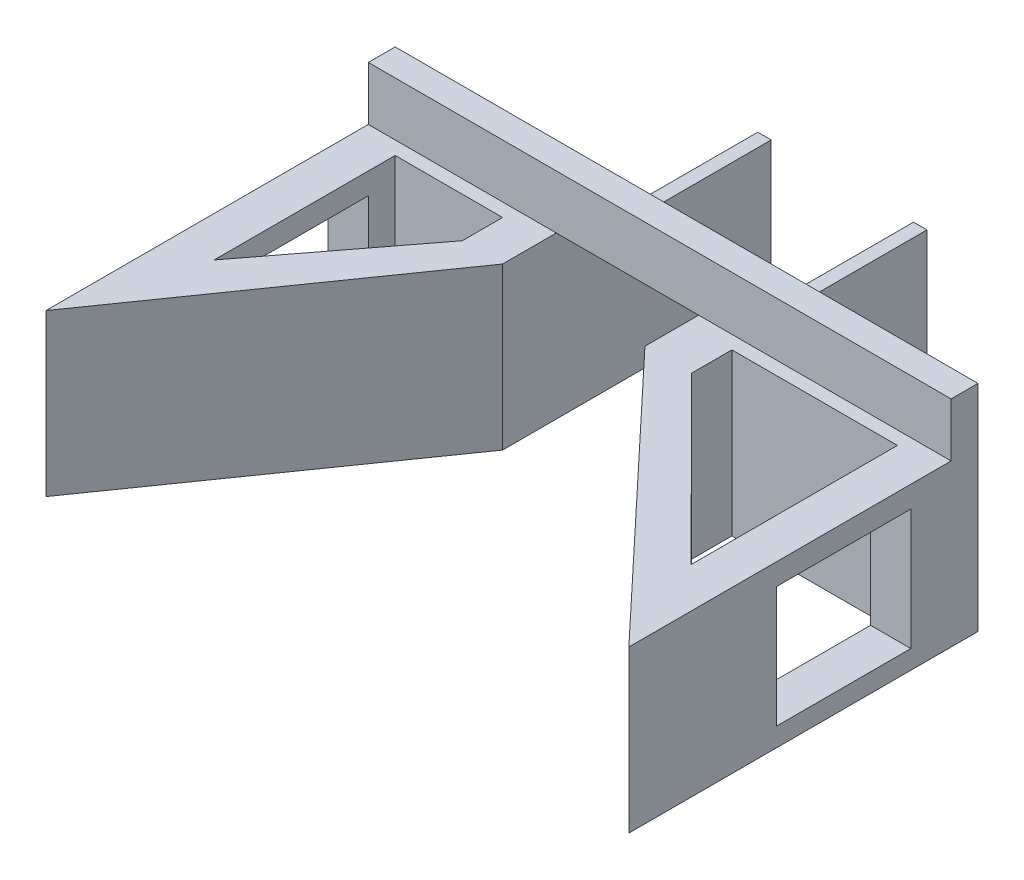
ISO-10303-21;
HEADER;
FILE_DESCRIPTION(('STEP AP214'),'2;1');
FILE_NAME('part.step','',(''),(''),'','','');
FILE_SCHEMA(('AUTOMOTIVE_DESIGN { 1 0 10303 214 1 1 1 1 }'));
ENDSEC;
DATA;
#1=APPLICATION_CONTEXT('core data for automotive mechanical design processes');
#2=APPLICATION_PROTOCOL_DEFINITION('international standard','automotive_design',2000,#1);
#3=PRODUCT_CONTEXT('',#1,'mechanical');
#4=PRODUCT('Part','Part','',(#3));
#5=PRODUCT_RELATED_PRODUCT_CATEGORY('part','',(#4));
#6=PRODUCT_DEFINITION_FORMATION('','',#4);
#7=PRODUCT_DEFINITION_CONTEXT('part definition',#1,'design');
#8=PRODUCT_DEFINITION('design','',#6,#7);
#9=PRODUCT_DEFINITION_SHAPE('','',#8);
#10=(LENGTH_UNIT() NAMED_UNIT(*) SI_UNIT(.MILLI.,.METRE.));
#11=(NAMED_UNIT(*) PLANE_ANGLE_UNIT() SI_UNIT($,.RADIAN.));
#12=(NAMED_UNIT(*) SI_UNIT($,.STERADIAN.) SOLID_ANGLE_UNIT());
#13=UNCERTAINTY_MEASURE_WITH_UNIT(LENGTH_MEASURE(1.E-05),#10,'distance_accuracy_value','');
#14=(GEOMETRIC_REPRESENTATION_CONTEXT(3) GLOBAL_UNCERTAINTY_ASSIGNED_CONTEXT((#13)) GLOBAL_UNIT_ASSIGNED_CONTEXT((#10,
#11,#12)) REPRESENTATION_CONTEXT('',''));
#15=CARTESIAN_POINT('',(0.,0.,0.));
#16=DIRECTION('',(0.,0.,1.));
#17=DIRECTION('',(1.,0.,0.));
#18=AXIS2_PLACEMENT_3D('',#15,#16,#17);
#19=CARTESIAN_POINT('',(0.,60.,0.));
#20=DIRECTION('',(0.,-1.,0.));
#21=DIRECTION('',(0.,0.,-1.));
#22=AXIS2_PLACEMENT_3D('',#19,#20,#21);
#23=PLANE('',#22);
#24=DIRECTION('',(0.705827946928191,0.,0.708383306787458));
#25=VECTOR('',#24,1.);
#26=CARTESIAN_POINT('',(17.378559694427,60.,-12.7008032128514));
#27=LINE('',#26,#25);
#28=CARTESIAN_POINT('',(17.378559694427,60.,-12.7008032128514));
#29=VERTEX_POINT('',#28);
#30=CARTESIAN_POINT('',(79.,60.,49.143729640576));
#31=VERTEX_POINT('',#30);
#32=EDGE_CURVE('E500',#29,#31,#27,.T.);
#33=ORIENTED_EDGE('',*,*,#32,.F.);
#34=DIRECTION('',(0.,0.,1.));
#35=VECTOR('',#34,1.);
#36=CARTESIAN_POINT('',(17.378559694427,60.,-27.7008032128514));
#37=LINE('',#36,#35);
#38=CARTESIAN_POINT('',(17.378559694427,60.,-27.7008032128514));
#39=VERTEX_POINT('',#38);
#40=EDGE_CURVE('E511',#39,#29,#37,.T.);
#41=ORIENTED_EDGE('',*,*,#40,.F.);
#42=DIRECTION('',(-1.,0.,0.));
#43=VECTOR('',#42,1.);
#44=CARTESIAN_POINT('',(79.,60.,-27.7008032128514));
#45=LINE('',#44,#43);
#46=CARTESIAN_POINT('',(79.,60.,-27.7008032128514));
#47=VERTEX_POINT('',#46);
#48=EDGE_CURVE('E507',#47,#39,#45,.T.);
#49=ORIENTED_EDGE('',*,*,#48,.F.);
#50=DIRECTION('',(0.,0.,-1.));
#51=VECTOR('',#50,1.);
#52=CARTESIAN_POINT('',(79.,60.,49.143729640576));
#53=LINE('',#52,#51);
#54=EDGE_CURVE('E503',#31,#47,#53,.T.);
#55=ORIENTED_EDGE('',*,*,#54,.F.);
#56=EDGE_LOOP('',(#33,#41,#49,#55));
#57=FACE_BOUND('',#56,.T.);
#58=DIRECTION('',(1.,0.,0.));
#59=VECTOR('',#58,1.);
#60=CARTESIAN_POINT('',(94.,60.,-32.7008032128514));
#61=LINE('',#60,#59);
#62=CARTESIAN_POINT('',(0.,60.,-32.7008032128514));
#63=VERTEX_POINT('',#62);
#64=CARTESIAN_POINT('',(94.,60.,-32.7008032128514));
#65=VERTEX_POINT('',#64);
#66=EDGE_CURVE('E373',#63,#65,#61,.T.);
#67=ORIENTED_EDGE('',*,*,#66,.F.);
#68=DIRECTION('',(0.,0.,1.));
#69=VECTOR('',#68,1.);
#70=CARTESIAN_POINT('',(0.,60.,-42.7008032128514));
#71=LINE('',#70,#69);
#72=CARTESIAN_POINT('',(0.,60.,-12.7008032128514));
#73=VERTEX_POINT('',#72);
#74=EDGE_CURVE('E548',#63,#73,#71,.T.);
#75=ORIENTED_EDGE('',*,*,#74,.T.);
#76=DIRECTION('',(0.684910008767887,0.,0.728627668902007));
#77=VECTOR('',#76,1.);
#78=CARTESIAN_POINT('',(94.,60.,87.2991967871486));
#79=LINE('',#78,#77);
#80=CARTESIAN_POINT('',(94.,60.,87.2991967871486));
#81=VERTEX_POINT('',#80);
#82=EDGE_CURVE('E547',#73,#81,#79,.T.);
#83=ORIENTED_EDGE('',*,*,#82,.T.);
#84=DIRECTION('',(0.,0.,-1.));
#85=VECTOR('',#84,1.);
#86=CARTESIAN_POINT('',(94.,60.,-42.7008032128514));
#87=LINE('',#86,#85);
#88=EDGE_CURVE('E551',#81,#65,#87,.T.);
#89=ORIENTED_EDGE('',*,*,#88,.T.);
#90=EDGE_LOOP('',(#67,#75,#83,#89));
#91=FACE_BOUND('',#90,.T.);
#92=ADVANCED_FACE('F41',(#57,#91),#23,.F.);
#93=CARTESIAN_POINT('',(0.,60.,-42.7008032128514));
#94=DIRECTION('',(0.,0.,1.));
#95=DIRECTION('',(1.,0.,0.));
#96=AXIS2_PLACEMENT_3D('',#93,#94,#95);
#97=PLANE('',#96);
#98=DIRECTION('',(0.,-1.,0.));
#99=VECTOR('',#98,1.);
#100=CARTESIAN_POINT('',(5.,50.,-42.7008032128514));
#101=LINE('',#100,#99);
#102=CARTESIAN_POINT('',(5.,50.,-42.7008032128514));
#103=VERTEX_POINT('',#102);
#104=CARTESIAN_POINT('',(5.,0.,-42.7008032128514));
#105=VERTEX_POINT('',#104);
#106=EDGE_CURVE('E490',#103,#105,#101,.T.);
#107=ORIENTED_EDGE('',*,*,#106,.F.);
#108=DIRECTION('',(-1.,0.,0.));
#109=VECTOR('',#108,1.);
#110=CARTESIAN_POINT('',(0.,50.,-42.7008032128514));
#111=LINE('',#110,#109);
#112=CARTESIAN_POINT('',(0.,50.,-42.7008032128514));
#113=VERTEX_POINT('',#112);
#114=EDGE_CURVE('E479',#103,#113,#111,.T.);
#115=ORIENTED_EDGE('',*,*,#114,.T.);
#116=DIRECTION('',(0.,-1.,0.));
#117=VECTOR('',#116,1.);
#118=CARTESIAN_POINT('',(0.,60.,-42.7008032128514));
#119=LINE('',#118,#117);
#120=CARTESIAN_POINT('',(0.,60.,-42.7008032128514));
#121=VERTEX_POINT('',#120);
#122=EDGE_CURVE('E578',#121,#113,#119,.T.);
#123=ORIENTED_EDGE('',*,*,#122,.F.);
#124=DIRECTION('',(-1.,0.,0.));
#125=VECTOR('',#124,1.);
#126=CARTESIAN_POINT('',(94.,60.,-42.7008032128514));
#127=LINE('',#126,#125);
#128=CARTESIAN_POINT('',(-53.,60.,-42.7008032128514));
#129=VERTEX_POINT('',#128);
#130=EDGE_CURVE('E348',#121,#129,#127,.T.);
#131=ORIENTED_EDGE('',*,*,#130,.T.);
#132=DIRECTION('',(0.,-1.,0.));
#133=VECTOR('',#132,1.);
#134=CARTESIAN_POINT('',(-53.,60.,-42.7008032128514));
#135=LINE('',#134,#133);
#136=CARTESIAN_POINT('',(-53.,50.,-42.7008032128514));
#137=VERTEX_POINT('',#136);
#138=EDGE_CURVE('E454',#129,#137,#135,.T.);
#139=ORIENTED_EDGE('',*,*,#138,.T.);
#140=DIRECTION('',(-1.,0.,0.));
#141=VECTOR('',#140,1.);
#142=CARTESIAN_POINT('',(-53.,50.,-42.7008032128514));
#143=LINE('',#142,#141);
#144=CARTESIAN_POINT('',(-58.,50.,-42.7008032128514));
#145=VERTEX_POINT('',#144);
#146=EDGE_CURVE('E324',#137,#145,#143,.T.);
#147=ORIENTED_EDGE('',*,*,#146,.T.);
#148=DIRECTION('',(0.,-1.,0.));
#149=VECTOR('',#148,1.);
#150=CARTESIAN_POINT('',(-58.,50.,-42.7008032128514));
#151=LINE('',#150,#149);
#152=CARTESIAN_POINT('',(-58.,0.,-42.7008032128514));
#153=VERTEX_POINT('',#152);
#154=EDGE_CURVE('E337',#145,#153,#151,.T.);
#155=ORIENTED_EDGE('',*,*,#154,.T.);
#156=DIRECTION('',(-1.,0.,0.));
#157=VECTOR('',#156,1.);
#158=CARTESIAN_POINT('',(-123.,0.,-42.7008032128514));
#159=LINE('',#158,#157);
#160=CARTESIAN_POINT('',(-123.,0.,-42.7008032128514));
#161=VERTEX_POINT('',#160);
#162=EDGE_CURVE('E433',#153,#161,#159,.T.);
#163=ORIENTED_EDGE('',*,*,#162,.T.);
#164=DIRECTION('',(0.,-1.,0.));
#165=VECTOR('',#164,1.);
#166=CARTESIAN_POINT('',(-123.,60.,-42.7008032128514));
#167=LINE('',#166,#165);
#168=CARTESIAN_POINT('',(-123.,80.,-42.7008032128514));
#169=VERTEX_POINT('',#168);
#170=EDGE_CURVE('E440',#169,#161,#167,.T.);
#171=ORIENTED_EDGE('',*,*,#170,.F.);
#172=DIRECTION('',(-1.,0.,0.));
#173=VECTOR('',#172,1.);
#174=CARTESIAN_POINT('',(94.,80.,-42.7008032128514));
#175=LINE('',#174,#173);
#176=CARTESIAN_POINT('',(94.,80.,-42.7008032128514));
#177=VERTEX_POINT('',#176);
#178=EDGE_CURVE('E359',#177,#169,#175,.T.);
#179=ORIENTED_EDGE('',*,*,#178,.F.);
#180=DIRECTION('',(0.,-1.,0.));
#181=VECTOR('',#180,1.);
#182=CARTESIAN_POINT('',(94.,60.,-42.7008032128514));
#183=LINE('',#182,#181);
#184=CARTESIAN_POINT('',(94.,0.,-42.7008032128514));
#185=VERTEX_POINT('',#184);
#186=EDGE_CURVE('E554',#177,#185,#183,.T.);
#187=ORIENTED_EDGE('',*,*,#186,.T.);
#188=DIRECTION('',(-1.,0.,0.));
#189=VECTOR('',#188,1.);
#190=CARTESIAN_POINT('',(0.,0.,-42.7008032128514));
#191=LINE('',#190,#189);
#192=EDGE_CURVE('E542',#185,#105,#191,.T.);
#193=ORIENTED_EDGE('',*,*,#192,.T.);
#194=EDGE_LOOP('',(#107,#115,#123,#131,#139,#147,#155,#163,#171,#179,#187,#193));
#195=FACE_BOUND('',#194,.T.);
#196=ADVANCED_FACE('F43',(#195),#97,.F.);
#197=CARTESIAN_POINT('',(0.,0.,0.));
#198=DIRECTION('',(0.,-1.,0.));
#199=DIRECTION('',(0.,0.,-1.));
#200=AXIS2_PLACEMENT_3D('',#197,#198,#199);
#201=PLANE('',#200);
#202=ORIENTED_EDGE('',*,*,#192,.F.);
#203=DIRECTION('',(0.,0.,-1.));
#204=VECTOR('',#203,1.);
#205=CARTESIAN_POINT('',(94.,0.,-42.7008032128514));
#206=LINE('',#205,#204);
#207=CARTESIAN_POINT('',(94.,0.,87.2991967871486));
#208=VERTEX_POINT('',#207);
#209=EDGE_CURVE('E564',#208,#185,#206,.T.);
#210=ORIENTED_EDGE('',*,*,#209,.F.);
#211=DIRECTION('',(0.684910008767887,0.,0.728627668902007));
#212=VECTOR('',#211,1.);
#213=CARTESIAN_POINT('',(94.,0.,87.2991967871486));
#214=LINE('',#213,#212);
#215=CARTESIAN_POINT('',(0.,0.,-12.7008032128514));
#216=VERTEX_POINT('',#215);
#217=EDGE_CURVE('E561',#216,#208,#214,.T.);
#218=ORIENTED_EDGE('',*,*,#217,.F.);
#219=DIRECTION('',(0.,0.,1.));
#220=VECTOR('',#219,1.);
#221=CARTESIAN_POINT('',(0.,0.,-12.7008032128514));
#222=LINE('',#221,#220);
#223=CARTESIAN_POINT('',(0.,0.,-112.700803212851));
#224=VERTEX_POINT('',#223);
#225=EDGE_CURVE('E558',#224,#216,#222,.T.);
#226=ORIENTED_EDGE('',*,*,#225,.F.);
#227=DIRECTION('',(1.,0.,0.));
#228=VECTOR('',#227,1.);
#229=CARTESIAN_POINT('',(0.,0.,-112.700803212851));
#230=LINE('',#229,#228);
#231=CARTESIAN_POINT('',(5.,0.,-112.700803212851));
#232=VERTEX_POINT('',#231);
#233=EDGE_CURVE('E466',#224,#232,#230,.T.);
#234=ORIENTED_EDGE('',*,*,#233,.T.);
#235=DIRECTION('',(0.,0.,1.));
#236=VECTOR('',#235,1.);
#237=CARTESIAN_POINT('',(5.,0.,-42.7008032128514));
#238=LINE('',#237,#236);
#239=EDGE_CURVE('E472',#232,#105,#238,.T.);
#240=ORIENTED_EDGE('',*,*,#239,.T.);
#241=EDGE_LOOP('',(#202,#210,#218,#226,#234,#240));
#242=FACE_BOUND('',#241,.T.);
#243=DIRECTION('',(0.,0.,1.));
#244=VECTOR('',#243,1.);
#245=CARTESIAN_POINT('',(17.378559694427,0.,-27.7008032128514));
#246=LINE('',#245,#244);
#247=CARTESIAN_POINT('',(17.378559694427,0.,-27.7008032128514));
#248=VERTEX_POINT('',#247);
#249=CARTESIAN_POINT('',(17.378559694427,0.,-12.7008032128514));
#250=VERTEX_POINT('',#249);
#251=EDGE_CURVE('E504',#248,#250,#246,.T.);
#252=ORIENTED_EDGE('',*,*,#251,.T.);
#253=DIRECTION('',(0.705827946928191,0.,0.708383306787458));
#254=VECTOR('',#253,1.);
#255=CARTESIAN_POINT('',(17.378559694427,0.,-12.7008032128514));
#256=LINE('',#255,#254);
#257=CARTESIAN_POINT('',(79.,0.,49.143729640576));
#258=VERTEX_POINT('',#257);
#259=EDGE_CURVE('E493',#250,#258,#256,.T.);
#260=ORIENTED_EDGE('',*,*,#259,.T.);
#261=DIRECTION('',(0.,0.,-1.));
#262=VECTOR('',#261,1.);
#263=CARTESIAN_POINT('',(79.,0.,49.143729640576));
#264=LINE('',#263,#262);
#265=CARTESIAN_POINT('',(79.,0.,-27.7008032128514));
#266=VERTEX_POINT('',#265);
#267=EDGE_CURVE('E518',#258,#266,#264,.T.);
#268=ORIENTED_EDGE('',*,*,#267,.T.);
#269=DIRECTION('',(-1.,0.,0.));
#270=VECTOR('',#269,1.);
#271=CARTESIAN_POINT('',(79.,0.,-27.7008032128514));
#272=LINE('',#271,#270);
#273=EDGE_CURVE('E522',#266,#248,#272,.T.);
#274=ORIENTED_EDGE('',*,*,#273,.T.);
#275=EDGE_LOOP('',(#252,#260,#268,#274));
#276=FACE_BOUND('',#275,.T.);
#277=ADVANCED_FACE('F629',(#242,#276),#201,.T.);
#278=CARTESIAN_POINT('',(0.,60.,-12.7008032128514));
#279=DIRECTION('',(1.,0.,0.));
#280=DIRECTION('',(0.,0.,-1.));
#281=AXIS2_PLACEMENT_3D('',#278,#279,#280);
#282=PLANE('',#281);
#283=ORIENTED_EDGE('',*,*,#225,.T.);
#284=DIRECTION('',(0.,-1.,0.));
#285=VECTOR('',#284,1.);
#286=CARTESIAN_POINT('',(0.,60.,-12.7008032128514));
#287=LINE('',#286,#285);
#288=EDGE_CURVE('E574',#73,#216,#287,.T.);
#289=ORIENTED_EDGE('',*,*,#288,.F.);
#290=ORIENTED_EDGE('',*,*,#74,.F.);
#291=EDGE_CURVE('E543',#121,#63,#71,.T.);
#292=ORIENTED_EDGE('',*,*,#291,.F.);
#293=ORIENTED_EDGE('',*,*,#122,.T.);
#294=DIRECTION('',(0.,0.,-1.));
#295=VECTOR('',#294,1.);
#296=CARTESIAN_POINT('',(0.,50.,-42.7008032128514));
#297=LINE('',#296,#295);
#298=CARTESIAN_POINT('',(0.,50.,-112.700803212851));
#299=VERTEX_POINT('',#298);
#300=EDGE_CURVE('E467',#113,#299,#297,.T.);
#301=ORIENTED_EDGE('',*,*,#300,.T.);
#302=DIRECTION('',(0.,-1.,0.));
#303=VECTOR('',#302,1.);
#304=CARTESIAN_POINT('',(0.,50.,-112.700803212851));
#305=LINE('',#304,#303);
#306=EDGE_CURVE('E483',#299,#224,#305,.T.);
#307=ORIENTED_EDGE('',*,*,#306,.T.);
#308=EDGE_LOOP('',(#283,#289,#290,#292,#293,#301,#307));
#309=FACE_BOUND('',#308,.T.);
#310=ADVANCED_FACE('F639',(#309),#282,.F.);
#311=CARTESIAN_POINT('',(94.,60.,87.2991967871486));
#312=DIRECTION('',(0.728627668902007,0.,-0.684910008767887));
#313=DIRECTION('',(-0.684910008767887,0.,-0.728627668902007));
#314=AXIS2_PLACEMENT_3D('',#311,#312,#313);
#315=PLANE('',#314);
#316=ORIENTED_EDGE('',*,*,#217,.T.);
#317=DIRECTION('',(0.,-1.,0.));
#318=VECTOR('',#317,1.);
#319=CARTESIAN_POINT('',(94.,60.,87.2991967871486));
#320=LINE('',#319,#318);
#321=EDGE_CURVE('E570',#81,#208,#320,.T.);
#322=ORIENTED_EDGE('',*,*,#321,.F.);
#323=ORIENTED_EDGE('',*,*,#82,.F.);
#324=ORIENTED_EDGE('',*,*,#288,.T.);
#325=EDGE_LOOP('',(#316,#322,#323,#324));
#326=FACE_BOUND('',#325,.T.);
#327=ADVANCED_FACE('F644',(#326),#315,.F.);
#328=CARTESIAN_POINT('',(94.,60.,-42.7008032128514));
#329=DIRECTION('',(-1.,0.,0.));
#330=DIRECTION('',(0.,0.,1.));
#331=AXIS2_PLACEMENT_3D('',#328,#329,#330);
#332=PLANE('',#331);
#333=DIRECTION('',(0.,0.,-1.));
#334=VECTOR('',#333,1.);
#335=CARTESIAN_POINT('',(94.,7.,32.2991967871486));
#336=LINE('',#335,#334);
#337=CARTESIAN_POINT('',(94.,7.,32.2991967871486));
#338=VERTEX_POINT('',#337);
#339=CARTESIAN_POINT('',(94.,7.,-17.7008032128514));
#340=VERTEX_POINT('',#339);
#341=EDGE_CURVE('E294',#338,#340,#336,.T.);
#342=ORIENTED_EDGE('',*,*,#341,.F.);
#343=DIRECTION('',(0.,-1.,0.));
#344=VECTOR('',#343,1.);
#345=CARTESIAN_POINT('',(94.,52.,32.2991967871486));
#346=LINE('',#345,#344);
#347=CARTESIAN_POINT('',(94.,52.,32.2991967871486));
#348=VERTEX_POINT('',#347);
#349=EDGE_CURVE('E287',#348,#338,#346,.T.);
#350=ORIENTED_EDGE('',*,*,#349,.F.);
#351=DIRECTION('',(0.,0.,1.));
#352=VECTOR('',#351,1.);
#353=CARTESIAN_POINT('',(94.,52.,32.2991967871486));
#354=LINE('',#353,#352);
#355=CARTESIAN_POINT('',(94.,52.,-17.7008032128514));
#356=VERTEX_POINT('',#355);
#357=EDGE_CURVE('E302',#356,#348,#354,.T.);
#358=ORIENTED_EDGE('',*,*,#357,.F.);
#359=DIRECTION('',(0.,1.,0.));
#360=VECTOR('',#359,1.);
#361=CARTESIAN_POINT('',(94.,52.,-17.7008032128514));
#362=LINE('',#361,#360);
#363=EDGE_CURVE('E298',#340,#356,#362,.T.);
#364=ORIENTED_EDGE('',*,*,#363,.F.);
#365=EDGE_LOOP('',(#342,#350,#358,#364));
#366=FACE_BOUND('',#365,.T.);
#367=ORIENTED_EDGE('',*,*,#209,.T.);
#368=ORIENTED_EDGE('',*,*,#186,.F.);
#369=DIRECTION('',(0.,0.,-1.));
#370=VECTOR('',#369,1.);
#371=CARTESIAN_POINT('',(94.,80.,-42.7008032128514));
#372=LINE('',#371,#370);
#373=CARTESIAN_POINT('',(94.,80.,-32.7008032128514));
#374=VERTEX_POINT('',#373);
#375=EDGE_CURVE('E355',#374,#177,#372,.T.);
#376=ORIENTED_EDGE('',*,*,#375,.F.);
#377=DIRECTION('',(0.,-1.,0.));
#378=VECTOR('',#377,1.);
#379=CARTESIAN_POINT('',(94.,80.,-32.7008032128514));
#380=LINE('',#379,#378);
#381=EDGE_CURVE('E370',#374,#65,#380,.T.);
#382=ORIENTED_EDGE('',*,*,#381,.T.);
#383=ORIENTED_EDGE('',*,*,#88,.F.);
#384=ORIENTED_EDGE('',*,*,#321,.T.);
#385=EDGE_LOOP('',(#367,#368,#376,#382,#383,#384));
#386=FACE_BOUND('',#385,.T.);
#387=ADVANCED_FACE('F641',(#366,#386),#332,.F.);
#388=CARTESIAN_POINT('',(17.378559694427,60.,-12.7008032128514));
#389=DIRECTION('',(0.708383306787459,0.,-0.705827946928191));
#390=DIRECTION('',(-0.705827946928191,0.,-0.708383306787459));
#391=AXIS2_PLACEMENT_3D('',#388,#389,#390);
#392=PLANE('',#391);
#393=ORIENTED_EDGE('',*,*,#259,.F.);
#394=DIRECTION('',(0.,-1.,0.));
#395=VECTOR('',#394,1.);
#396=CARTESIAN_POINT('',(17.378559694427,60.,-12.7008032128514));
#397=LINE('',#396,#395);
#398=EDGE_CURVE('E514',#29,#250,#397,.T.);
#399=ORIENTED_EDGE('',*,*,#398,.F.);
#400=ORIENTED_EDGE('',*,*,#32,.T.);
#401=DIRECTION('',(0.,-1.,0.));
#402=VECTOR('',#401,1.);
#403=CARTESIAN_POINT('',(79.,60.,49.143729640576));
#404=LINE('',#403,#402);
#405=EDGE_CURVE('E538',#31,#258,#404,.T.);
#406=ORIENTED_EDGE('',*,*,#405,.T.);
#407=EDGE_LOOP('',(#393,#399,#400,#406));
#408=FACE_BOUND('',#407,.T.);
#409=ADVANCED_FACE('F635',(#408),#392,.T.);
#410=CARTESIAN_POINT('',(79.,60.,49.143729640576));
#411=DIRECTION('',(-1.,0.,0.));
#412=DIRECTION('',(0.,0.,1.));
#413=AXIS2_PLACEMENT_3D('',#410,#411,#412);
#414=PLANE('',#413);
#415=DIRECTION('',(0.,1.,0.));
#416=VECTOR('',#415,1.);
#417=CARTESIAN_POINT('',(79.,60.,32.2991967871486));
#418=LINE('',#417,#416);
#419=CARTESIAN_POINT('',(79.,7.,32.2991967871486));
#420=VERTEX_POINT('',#419);
#421=CARTESIAN_POINT('',(79.,52.,32.2991967871486));
#422=VERTEX_POINT('',#421);
#423=EDGE_CURVE('E592',#420,#422,#418,.T.);
#424=ORIENTED_EDGE('',*,*,#423,.F.);
#425=DIRECTION('',(0.,0.,1.));
#426=VECTOR('',#425,1.);
#427=CARTESIAN_POINT('',(79.,7.,49.143729640576));
#428=LINE('',#427,#426);
#429=CARTESIAN_POINT('',(79.,7.,-17.7008032128514));
#430=VERTEX_POINT('',#429);
#431=EDGE_CURVE('E582',#430,#420,#428,.T.);
#432=ORIENTED_EDGE('',*,*,#431,.F.);
#433=DIRECTION('',(0.,-1.,0.));
#434=VECTOR('',#433,1.);
#435=CARTESIAN_POINT('',(79.,60.,-17.7008032128514));
#436=LINE('',#435,#434);
#437=CARTESIAN_POINT('',(79.,52.,-17.7008032128514));
#438=VERTEX_POINT('',#437);
#439=EDGE_CURVE('E585',#438,#430,#436,.T.);
#440=ORIENTED_EDGE('',*,*,#439,.F.);
#441=DIRECTION('',(0.,0.,-1.));
#442=VECTOR('',#441,1.);
#443=CARTESIAN_POINT('',(79.,52.,49.143729640576));
#444=LINE('',#443,#442);
#445=EDGE_CURVE('E589',#422,#438,#444,.T.);
#446=ORIENTED_EDGE('',*,*,#445,.F.);
#447=EDGE_LOOP('',(#424,#432,#440,#446));
#448=FACE_BOUND('',#447,.T.);
#449=ORIENTED_EDGE('',*,*,#267,.F.);
#450=ORIENTED_EDGE('',*,*,#405,.F.);
#451=ORIENTED_EDGE('',*,*,#54,.T.);
#452=DIRECTION('',(0.,-1.,0.));
#453=VECTOR('',#452,1.);
#454=CARTESIAN_POINT('',(79.,60.,-27.7008032128514));
#455=LINE('',#454,#453);
#456=EDGE_CURVE('E535',#47,#266,#455,.T.);
#457=ORIENTED_EDGE('',*,*,#456,.T.);
#458=EDGE_LOOP('',(#449,#450,#451,#457));
#459=FACE_BOUND('',#458,.T.);
#460=ADVANCED_FACE('F746',(#448,#459),#414,.T.);
#461=CARTESIAN_POINT('',(79.,60.,-27.7008032128514));
#462=DIRECTION('',(0.,0.,1.));
#463=DIRECTION('',(1.,0.,0.));
#464=AXIS2_PLACEMENT_3D('',#461,#462,#463);
#465=PLANE('',#464);
#466=ORIENTED_EDGE('',*,*,#273,.F.);
#467=ORIENTED_EDGE('',*,*,#456,.F.);
#468=ORIENTED_EDGE('',*,*,#48,.T.);
#469=DIRECTION('',(0.,-1.,0.));
#470=VECTOR('',#469,1.);
#471=CARTESIAN_POINT('',(17.378559694427,60.,-27.7008032128514));
#472=LINE('',#471,#470);
#473=EDGE_CURVE('E532',#39,#248,#472,.T.);
#474=ORIENTED_EDGE('',*,*,#473,.T.);
#475=EDGE_LOOP('',(#466,#467,#468,#474));
#476=FACE_BOUND('',#475,.T.);
#477=ADVANCED_FACE('F743',(#476),#465,.T.);
#478=CARTESIAN_POINT('',(17.378559694427,60.,-27.7008032128514));
#479=DIRECTION('',(1.,0.,0.));
#480=DIRECTION('',(0.,0.,-1.));
#481=AXIS2_PLACEMENT_3D('',#478,#479,#480);
#482=PLANE('',#481);
#483=ORIENTED_EDGE('',*,*,#251,.F.);
#484=ORIENTED_EDGE('',*,*,#473,.F.);
#485=ORIENTED_EDGE('',*,*,#40,.T.);
#486=ORIENTED_EDGE('',*,*,#398,.T.);
#487=EDGE_LOOP('',(#483,#484,#485,#486));
#488=FACE_BOUND('',#487,.T.);
#489=ADVANCED_FACE('F736',(#488),#482,.T.);
#490=CARTESIAN_POINT('',(5.,50.,-42.7008032128514));
#491=DIRECTION('',(1.,0.,0.));
#492=DIRECTION('',(0.,0.,-1.));
#493=AXIS2_PLACEMENT_3D('',#490,#491,#492);
#494=PLANE('',#493);
#495=ORIENTED_EDGE('',*,*,#239,.F.);
#496=DIRECTION('',(0.,-1.,0.));
#497=VECTOR('',#496,1.);
#498=CARTESIAN_POINT('',(5.,50.,-112.700803212851));
#499=LINE('',#498,#497);
#500=CARTESIAN_POINT('',(5.,50.,-112.700803212851));
#501=VERTEX_POINT('',#500);
#502=EDGE_CURVE('E494',#501,#232,#499,.T.);
#503=ORIENTED_EDGE('',*,*,#502,.F.);
#504=DIRECTION('',(0.,0.,1.));
#505=VECTOR('',#504,1.);
#506=CARTESIAN_POINT('',(5.,50.,-42.7008032128514));
#507=LINE('',#506,#505);
#508=EDGE_CURVE('E476',#501,#103,#507,.T.);
#509=ORIENTED_EDGE('',*,*,#508,.T.);
#510=ORIENTED_EDGE('',*,*,#106,.T.);
#511=EDGE_LOOP('',(#495,#503,#509,#510));
#512=FACE_BOUND('',#511,.T.);
#513=ADVANCED_FACE('F733',(#512),#494,.T.);
#514=CARTESIAN_POINT('',(0.,50.,-112.700803212851));
#515=DIRECTION('',(0.,0.,-1.));
#516=DIRECTION('',(-1.,0.,0.));
#517=AXIS2_PLACEMENT_3D('',#514,#515,#516);
#518=PLANE('',#517);
#519=ORIENTED_EDGE('',*,*,#233,.F.);
#520=ORIENTED_EDGE('',*,*,#306,.F.);
#521=DIRECTION('',(1.,0.,0.));
#522=VECTOR('',#521,1.);
#523=CARTESIAN_POINT('',(0.,50.,-112.700803212851));
#524=LINE('',#523,#522);
#525=EDGE_CURVE('E471',#299,#501,#524,.T.);
#526=ORIENTED_EDGE('',*,*,#525,.T.);
#527=ORIENTED_EDGE('',*,*,#502,.T.);
#528=EDGE_LOOP('',(#519,#520,#526,#527));
#529=FACE_BOUND('',#528,.T.);
#530=ADVANCED_FACE('F731',(#529),#518,.T.);
#531=CARTESIAN_POINT('',(0.,50.,0.));
#532=DIRECTION('',(0.,-1.,0.));
#533=DIRECTION('',(0.,0.,-1.));
#534=AXIS2_PLACEMENT_3D('',#531,#532,#533);
#535=PLANE('',#534);
#536=ORIENTED_EDGE('',*,*,#300,.F.);
#537=ORIENTED_EDGE('',*,*,#114,.F.);
#538=ORIENTED_EDGE('',*,*,#508,.F.);
#539=ORIENTED_EDGE('',*,*,#525,.F.);
#540=EDGE_LOOP('',(#536,#537,#538,#539));
#541=FACE_BOUND('',#540,.T.);
#542=ADVANCED_FACE('F728',(#541),#535,.F.);
#543=CARTESIAN_POINT('',(0.,60.,0.));
#544=DIRECTION('',(0.,-1.,0.));
#545=DIRECTION('',(0.,0.,-1.));
#546=AXIS2_PLACEMENT_3D('',#543,#544,#545);
#547=PLANE('',#546);
#548=ORIENTED_EDGE('',*,*,#291,.T.);
#549=CARTESIAN_POINT('',(-53.,60.,-32.7008032128514));
#550=VERTEX_POINT('',#549);
#551=EDGE_CURVE('E377',#550,#63,#61,.T.);
#552=ORIENTED_EDGE('',*,*,#551,.F.);
#553=DIRECTION('',(0.,0.,-1.));
#554=VECTOR('',#553,1.);
#555=CARTESIAN_POINT('',(-53.,60.,-12.7008032128514));
#556=LINE('',#555,#554);
#557=EDGE_CURVE('E436',#550,#129,#556,.T.);
#558=ORIENTED_EDGE('',*,*,#557,.T.);
#559=ORIENTED_EDGE('',*,*,#130,.F.);
#560=EDGE_LOOP('',(#548,#552,#558,#559));
#561=FACE_BOUND('',#560,.T.);
#562=ADVANCED_FACE('F684',(#561),#547,.T.);
#563=CARTESIAN_POINT('',(0.,60.,0.));
#564=DIRECTION('',(0.,1.,0.));
#565=DIRECTION('',(0.,0.,1.));
#566=AXIS2_PLACEMENT_3D('',#563,#564,#565);
#567=PLANE('',#566);
#568=CARTESIAN_POINT('',(-123.,60.,-32.7008032128514));
#569=VERTEX_POINT('',#568);
#570=EDGE_CURVE('E360',#569,#550,#61,.T.);
#571=ORIENTED_EDGE('',*,*,#570,.F.);
#572=DIRECTION('',(0.,0.,1.));
#573=VECTOR('',#572,1.);
#574=CARTESIAN_POINT('',(-123.,60.,-42.7008032128514));
#575=LINE('',#574,#573);
#576=CARTESIAN_POINT('',(-123.,60.,87.2991967871486));
#577=VERTEX_POINT('',#576);
#578=EDGE_CURVE('E429',#569,#577,#575,.T.);
#579=ORIENTED_EDGE('',*,*,#578,.T.);
#580=DIRECTION('',(0.573462344363328,0.,-0.81923192051904));
#581=VECTOR('',#580,1.);
#582=CARTESIAN_POINT('',(-123.,60.,87.2991967871486));
#583=LINE('',#582,#581);
#584=CARTESIAN_POINT('',(-53.,60.,-12.7008032128514));
#585=VERTEX_POINT('',#584);
#586=EDGE_CURVE('E432',#577,#585,#583,.T.);
#587=ORIENTED_EDGE('',*,*,#586,.T.);
#588=EDGE_CURVE('E437',#585,#550,#556,.T.);
#589=ORIENTED_EDGE('',*,*,#588,.T.);
#590=EDGE_LOOP('',(#571,#579,#587,#589));
#591=FACE_BOUND('',#590,.T.);
#592=DIRECTION('',(0.,0.,1.));
#593=VECTOR('',#592,1.);
#594=CARTESIAN_POINT('',(-108.,60.,-27.7008032128514));
#595=LINE('',#594,#593);
#596=CARTESIAN_POINT('',(-108.,60.,-27.7008032128514));
#597=VERTEX_POINT('',#596);
#598=CARTESIAN_POINT('',(-108.,60.,39.7137204677193));
#599=VERTEX_POINT('',#598);
#600=EDGE_CURVE('E389',#597,#599,#595,.T.);
#601=ORIENTED_EDGE('',*,*,#600,.F.);
#602=DIRECTION('',(-1.,0.,0.));
#603=VECTOR('',#602,1.);
#604=CARTESIAN_POINT('',(-68.,60.,-27.7008032128514));
#605=LINE('',#604,#603);
#606=CARTESIAN_POINT('',(-68.,60.,-27.7008032128514));
#607=VERTEX_POINT('',#606);
#608=EDGE_CURVE('E386',#607,#597,#605,.T.);
#609=ORIENTED_EDGE('',*,*,#608,.F.);
#610=DIRECTION('',(0.,0.,-1.));
#611=VECTOR('',#610,1.);
#612=CARTESIAN_POINT('',(-68.,60.,-12.7008032128502));
#613=LINE('',#612,#611);
#614=CARTESIAN_POINT('',(-68.,60.,-12.7008032128502));
#615=VERTEX_POINT('',#614);
#616=EDGE_CURVE('E397',#615,#607,#613,.T.);
#617=ORIENTED_EDGE('',*,*,#616,.F.);
#618=DIRECTION('',(0.606667975507678,0.,-0.794955324212257));
#619=VECTOR('',#618,1.);
#620=CARTESIAN_POINT('',(-108.,60.,39.7137204677193));
#621=LINE('',#620,#619);
#622=EDGE_CURVE('E393',#599,#615,#621,.T.);
#623=ORIENTED_EDGE('',*,*,#622,.F.);
#624=EDGE_LOOP('',(#601,#609,#617,#623));
#625=FACE_BOUND('',#624,.T.);
#626=ADVANCED_FACE('F711',(#591,#625),#567,.T.);
#627=CARTESIAN_POINT('',(0.,0.,0.));
#628=DIRECTION('',(0.,1.,0.));
#629=DIRECTION('',(0.,0.,1.));
#630=AXIS2_PLACEMENT_3D('',#627,#628,#629);
#631=PLANE('',#630);
#632=DIRECTION('',(0.,0.,1.));
#633=VECTOR('',#632,1.);
#634=CARTESIAN_POINT('',(-123.,0.,-12.7008032128514));
#635=LINE('',#634,#633);
#636=CARTESIAN_POINT('',(-123.,0.,87.2991967871486));
#637=VERTEX_POINT('',#636);
#638=EDGE_CURVE('E428',#161,#637,#635,.T.);
#639=ORIENTED_EDGE('',*,*,#638,.F.);
#640=ORIENTED_EDGE('',*,*,#162,.F.);
#641=DIRECTION('',(0.,0.,-1.));
#642=VECTOR('',#641,1.);
#643=CARTESIAN_POINT('',(-58.,0.,-42.7008032128514));
#644=LINE('',#643,#642);
#645=CARTESIAN_POINT('',(-58.,0.,-112.700803212851));
#646=VERTEX_POINT('',#645);
#647=EDGE_CURVE('E310',#153,#646,#644,.T.);
#648=ORIENTED_EDGE('',*,*,#647,.T.);
#649=DIRECTION('',(1.,0.,0.));
#650=VECTOR('',#649,1.);
#651=CARTESIAN_POINT('',(-53.,0.,-112.700803212851));
#652=LINE('',#651,#650);
#653=CARTESIAN_POINT('',(-53.,0.,-112.700803212851));
#654=VERTEX_POINT('',#653);
#655=EDGE_CURVE('E325',#646,#654,#652,.T.);
#656=ORIENTED_EDGE('',*,*,#655,.T.);
#657=DIRECTION('',(0.,0.,-1.));
#658=VECTOR('',#657,1.);
#659=CARTESIAN_POINT('',(-53.,0.,-12.7008032128514));
#660=LINE('',#659,#658);
#661=CARTESIAN_POINT('',(-53.,0.,-12.7008032128514));
#662=VERTEX_POINT('',#661);
#663=EDGE_CURVE('E446',#662,#654,#660,.T.);
#664=ORIENTED_EDGE('',*,*,#663,.F.);
#665=DIRECTION('',(0.573462344363328,0.,-0.81923192051904));
#666=VECTOR('',#665,1.);
#667=CARTESIAN_POINT('',(-123.,0.,87.2991967871486));
#668=LINE('',#667,#666);
#669=EDGE_CURVE('E443',#637,#662,#668,.T.);
#670=ORIENTED_EDGE('',*,*,#669,.F.);
#671=EDGE_LOOP('',(#639,#640,#648,#656,#664,#670));
#672=FACE_BOUND('',#671,.T.);
#673=DIRECTION('',(-1.,0.,0.));
#674=VECTOR('',#673,1.);
#675=CARTESIAN_POINT('',(-68.,0.,-27.7008032128514));
#676=LINE('',#675,#674);
#677=CARTESIAN_POINT('',(-68.,0.,-27.7008032128514));
#678=VERTEX_POINT('',#677);
#679=CARTESIAN_POINT('',(-108.,0.,-27.7008032128514));
#680=VERTEX_POINT('',#679);
#681=EDGE_CURVE('E385',#678,#680,#676,.T.);
#682=ORIENTED_EDGE('',*,*,#681,.T.);
#683=DIRECTION('',(0.,0.,1.));
#684=VECTOR('',#683,1.);
#685=CARTESIAN_POINT('',(-108.,0.,-27.7008032128514));
#686=LINE('',#685,#684);
#687=CARTESIAN_POINT('',(-108.,0.,39.7137204677193));
#688=VERTEX_POINT('',#687);
#689=EDGE_CURVE('E404',#680,#688,#686,.T.);
#690=ORIENTED_EDGE('',*,*,#689,.T.);
#691=DIRECTION('',(0.606667975507678,0.,-0.794955324212257));
#692=VECTOR('',#691,1.);
#693=CARTESIAN_POINT('',(-108.,0.,39.7137204677193));
#694=LINE('',#693,#692);
#695=CARTESIAN_POINT('',(-68.,0.,-12.7008032128502));
#696=VERTEX_POINT('',#695);
#697=EDGE_CURVE('E408',#688,#696,#694,.T.);
#698=ORIENTED_EDGE('',*,*,#697,.T.);
#699=DIRECTION('',(0.,0.,-1.));
#700=VECTOR('',#699,1.);
#701=CARTESIAN_POINT('',(-68.,0.,-12.7008032128502));
#702=LINE('',#701,#700);
#703=EDGE_CURVE('E390',#696,#678,#702,.T.);
#704=ORIENTED_EDGE('',*,*,#703,.T.);
#705=EDGE_LOOP('',(#682,#690,#698,#704));
#706=FACE_BOUND('',#705,.T.);
#707=ADVANCED_FACE('F703',(#672,#706),#631,.F.);
#708=CARTESIAN_POINT('',(-123.,60.,-12.7008032128514));
#709=DIRECTION('',(1.,0.,0.));
#710=DIRECTION('',(0.,0.,-1.));
#711=AXIS2_PLACEMENT_3D('',#708,#709,#710);
#712=PLANE('',#711);
#713=DIRECTION('',(0.,0.,1.));
#714=VECTOR('',#713,1.);
#715=CARTESIAN_POINT('',(-123.,7.,-17.7008032128514));
#716=LINE('',#715,#714);
#717=CARTESIAN_POINT('',(-123.,7.,-17.7008032128514));
#718=VERTEX_POINT('',#717);
#719=CARTESIAN_POINT('',(-123.,7.,32.2991967871486));
#720=VERTEX_POINT('',#719);
#721=EDGE_CURVE('E269',#718,#720,#716,.T.);
#722=ORIENTED_EDGE('',*,*,#721,.F.);
#723=DIRECTION('',(0.,-1.,0.));
#724=VECTOR('',#723,1.);
#725=CARTESIAN_POINT('',(-123.,52.,-17.7008032128514));
#726=LINE('',#725,#724);
#727=CARTESIAN_POINT('',(-123.,52.,-17.7008032128514));
#728=VERTEX_POINT('',#727);
#729=EDGE_CURVE('E57',#728,#718,#726,.T.);
#730=ORIENTED_EDGE('',*,*,#729,.F.);
#731=DIRECTION('',(0.,0.,-1.));
#732=VECTOR('',#731,1.);
#733=CARTESIAN_POINT('',(-123.,52.,-17.7008032128514));
#734=LINE('',#733,#732);
#735=CARTESIAN_POINT('',(-123.,52.,32.2991967871486));
#736=VERTEX_POINT('',#735);
#737=EDGE_CURVE('E277',#736,#728,#734,.T.);
#738=ORIENTED_EDGE('',*,*,#737,.F.);
#739=DIRECTION('',(0.,1.,0.));
#740=VECTOR('',#739,1.);
#741=CARTESIAN_POINT('',(-123.,52.,32.2991967871486));
#742=LINE('',#741,#740);
#743=EDGE_CURVE('E259',#720,#736,#742,.T.);
#744=ORIENTED_EDGE('',*,*,#743,.F.);
#745=EDGE_LOOP('',(#722,#730,#738,#744));
#746=FACE_BOUND('',#745,.T.);
#747=ORIENTED_EDGE('',*,*,#638,.T.);
#748=DIRECTION('',(0.,-1.,0.));
#749=VECTOR('',#748,1.);
#750=CARTESIAN_POINT('',(-123.,60.,87.2991967871486));
#751=LINE('',#750,#749);
#752=EDGE_CURVE('E462',#577,#637,#751,.T.);
#753=ORIENTED_EDGE('',*,*,#752,.F.);
#754=ORIENTED_EDGE('',*,*,#578,.F.);
#755=DIRECTION('',(0.,-1.,0.));
#756=VECTOR('',#755,1.);
#757=CARTESIAN_POINT('',(-123.,80.,-32.7008032128514));
#758=LINE('',#757,#756);
#759=CARTESIAN_POINT('',(-123.,80.,-32.7008032128514));
#760=VERTEX_POINT('',#759);
#761=EDGE_CURVE('E381',#760,#569,#758,.T.);
#762=ORIENTED_EDGE('',*,*,#761,.F.);
#763=DIRECTION('',(0.,0.,1.));
#764=VECTOR('',#763,1.);
#765=CARTESIAN_POINT('',(-123.,80.,-42.7008032128514));
#766=LINE('',#765,#764);
#767=EDGE_CURVE('E364',#169,#760,#766,.T.);
#768=ORIENTED_EDGE('',*,*,#767,.F.);
#769=ORIENTED_EDGE('',*,*,#170,.T.);
#770=EDGE_LOOP('',(#747,#753,#754,#762,#768,#769));
#771=FACE_BOUND('',#770,.T.);
#772=ADVANCED_FACE('F274',(#746,#771),#712,.F.);
#773=CARTESIAN_POINT('',(-123.,60.,87.2991967871486));
#774=DIRECTION('',(-0.81923192051904,0.,-0.573462344363328));
#775=DIRECTION('',(-0.573462344363328,0.,0.81923192051904));
#776=AXIS2_PLACEMENT_3D('',#773,#774,#775);
#777=PLANE('',#776);
#778=ORIENTED_EDGE('',*,*,#669,.T.);
#779=DIRECTION('',(0.,-1.,0.));
#780=VECTOR('',#779,1.);
#781=CARTESIAN_POINT('',(-53.,60.,-12.7008032128514));
#782=LINE('',#781,#780);
#783=EDGE_CURVE('E458',#585,#662,#782,.T.);
#784=ORIENTED_EDGE('',*,*,#783,.F.);
#785=ORIENTED_EDGE('',*,*,#586,.F.);
#786=ORIENTED_EDGE('',*,*,#752,.T.);
#787=EDGE_LOOP('',(#778,#784,#785,#786));
#788=FACE_BOUND('',#787,.T.);
#789=ADVANCED_FACE('F716',(#788),#777,.F.);
#790=CARTESIAN_POINT('',(-53.,60.,-12.7008032128514));
#791=DIRECTION('',(-1.,0.,0.));
#792=DIRECTION('',(0.,0.,1.));
#793=AXIS2_PLACEMENT_3D('',#790,#791,#792);
#794=PLANE('',#793);
#795=ORIENTED_EDGE('',*,*,#663,.T.);
#796=DIRECTION('',(0.,-1.,0.));
#797=VECTOR('',#796,1.);
#798=CARTESIAN_POINT('',(-53.,50.,-112.700803212851));
#799=LINE('',#798,#797);
#800=CARTESIAN_POINT('',(-53.,50.,-112.700803212851));
#801=VERTEX_POINT('',#800);
#802=EDGE_CURVE('E344',#801,#654,#799,.T.);
#803=ORIENTED_EDGE('',*,*,#802,.F.);
#804=DIRECTION('',(0.,0.,1.));
#805=VECTOR('',#804,1.);
#806=CARTESIAN_POINT('',(-53.,50.,-42.7008032128514));
#807=LINE('',#806,#805);
#808=EDGE_CURVE('E320',#801,#137,#807,.T.);
#809=ORIENTED_EDGE('',*,*,#808,.T.);
#810=ORIENTED_EDGE('',*,*,#138,.F.);
#811=ORIENTED_EDGE('',*,*,#557,.F.);
#812=ORIENTED_EDGE('',*,*,#588,.F.);
#813=ORIENTED_EDGE('',*,*,#783,.T.);
#814=EDGE_LOOP('',(#795,#803,#809,#810,#811,#812,#813));
#815=FACE_BOUND('',#814,.T.);
#816=ADVANCED_FACE('F688',(#815),#794,.F.);
#817=CARTESIAN_POINT('',(-68.,60.,-27.7008032128514));
#818=DIRECTION('',(0.,0.,1.));
#819=DIRECTION('',(1.,0.,0.));
#820=AXIS2_PLACEMENT_3D('',#817,#818,#819);
#821=PLANE('',#820);
#822=ORIENTED_EDGE('',*,*,#681,.F.);
#823=DIRECTION('',(0.,-1.,0.));
#824=VECTOR('',#823,1.);
#825=CARTESIAN_POINT('',(-68.,60.,-27.7008032128514));
#826=LINE('',#825,#824);
#827=EDGE_CURVE('E400',#607,#678,#826,.T.);
#828=ORIENTED_EDGE('',*,*,#827,.F.);
#829=ORIENTED_EDGE('',*,*,#608,.T.);
#830=DIRECTION('',(0.,-1.,0.));
#831=VECTOR('',#830,1.);
#832=CARTESIAN_POINT('',(-108.,60.,-27.7008032128514));
#833=LINE('',#832,#831);
#834=EDGE_CURVE('E424',#597,#680,#833,.T.);
#835=ORIENTED_EDGE('',*,*,#834,.T.);
#836=EDGE_LOOP('',(#822,#828,#829,#835));
#837=FACE_BOUND('',#836,.T.);
#838=ADVANCED_FACE('F723',(#837),#821,.T.);
#839=CARTESIAN_POINT('',(-108.,60.,-27.7008032128514));
#840=DIRECTION('',(1.,0.,0.));
#841=DIRECTION('',(0.,0.,-1.));
#842=AXIS2_PLACEMENT_3D('',#839,#840,#841);
#843=PLANE('',#842);
#844=DIRECTION('',(0.,1.,0.));
#845=VECTOR('',#844,1.);
#846=CARTESIAN_POINT('',(-108.,60.,-17.7008032128514));
#847=LINE('',#846,#845);
#848=CARTESIAN_POINT('',(-108.,7.,-17.7008032128514));
#849=VERTEX_POINT('',#848);
#850=CARTESIAN_POINT('',(-108.,52.,-17.7008032128514));
#851=VERTEX_POINT('',#850);
#852=EDGE_CURVE('E11',#849,#851,#847,.T.);
#853=ORIENTED_EDGE('',*,*,#852,.F.);
#854=DIRECTION('',(0.,0.,-1.));
#855=VECTOR('',#854,1.);
#856=CARTESIAN_POINT('',(-108.,7.,-27.7008032128514));
#857=LINE('',#856,#855);
#858=CARTESIAN_POINT('',(-108.,7.,32.2991967871486));
#859=VERTEX_POINT('',#858);
#860=EDGE_CURVE('E595',#859,#849,#857,.T.);
#861=ORIENTED_EDGE('',*,*,#860,.F.);
#862=DIRECTION('',(0.,-1.,0.));
#863=VECTOR('',#862,1.);
#864=CARTESIAN_POINT('',(-108.,60.,32.2991967871486));
#865=LINE('',#864,#863);
#866=CARTESIAN_POINT('',(-108.,52.,32.2991967871486));
#867=VERTEX_POINT('',#866);
#868=EDGE_CURVE('E262',#867,#859,#865,.T.);
#869=ORIENTED_EDGE('',*,*,#868,.F.);
#870=DIRECTION('',(0.,0.,1.));
#871=VECTOR('',#870,1.);
#872=CARTESIAN_POINT('',(-108.,52.,-27.7008032128514));
#873=LINE('',#872,#871);
#874=EDGE_CURVE('E50',#851,#867,#873,.T.);
#875=ORIENTED_EDGE('',*,*,#874,.F.);
#876=EDGE_LOOP('',(#853,#861,#869,#875));
#877=FACE_BOUND('',#876,.T.);
#878=ORIENTED_EDGE('',*,*,#689,.F.);
#879=ORIENTED_EDGE('',*,*,#834,.F.);
#880=ORIENTED_EDGE('',*,*,#600,.T.);
#881=DIRECTION('',(0.,-1.,0.));
#882=VECTOR('',#881,1.);
#883=CARTESIAN_POINT('',(-108.,60.,39.7137204677193));
#884=LINE('',#883,#882);
#885=EDGE_CURVE('E421',#599,#688,#884,.T.);
#886=ORIENTED_EDGE('',*,*,#885,.T.);
#887=EDGE_LOOP('',(#878,#879,#880,#886));
#888=FACE_BOUND('',#887,.T.);
#889=ADVANCED_FACE('F606',(#877,#888),#843,.T.);
#890=CARTESIAN_POINT('',(-108.,60.,39.7137204677193));
#891=DIRECTION('',(-0.794955324212257,0.,-0.606667975507678));
#892=DIRECTION('',(-0.606667975507678,0.,0.794955324212257));
#893=AXIS2_PLACEMENT_3D('',#890,#891,#892);
#894=PLANE('',#893);
#895=ORIENTED_EDGE('',*,*,#697,.F.);
#896=ORIENTED_EDGE('',*,*,#885,.F.);
#897=ORIENTED_EDGE('',*,*,#622,.T.);
#898=DIRECTION('',(0.,-1.,0.));
#899=VECTOR('',#898,1.);
#900=CARTESIAN_POINT('',(-68.,60.,-12.7008032128502));
#901=LINE('',#900,#899);
#902=EDGE_CURVE('E418',#615,#696,#901,.T.);
#903=ORIENTED_EDGE('',*,*,#902,.T.);
#904=EDGE_LOOP('',(#895,#896,#897,#903));
#905=FACE_BOUND('',#904,.T.);
#906=ADVANCED_FACE('F802',(#905),#894,.T.);
#907=CARTESIAN_POINT('',(-68.,60.,-12.7008032128502));
#908=DIRECTION('',(-1.,0.,0.));
#909=DIRECTION('',(0.,0.,1.));
#910=AXIS2_PLACEMENT_3D('',#907,#908,#909);
#911=PLANE('',#910);
#912=ORIENTED_EDGE('',*,*,#703,.F.);
#913=ORIENTED_EDGE('',*,*,#902,.F.);
#914=ORIENTED_EDGE('',*,*,#616,.T.);
#915=ORIENTED_EDGE('',*,*,#827,.T.);
#916=EDGE_LOOP('',(#912,#913,#914,#915));
#917=FACE_BOUND('',#916,.T.);
#918=ADVANCED_FACE('F799',(#917),#911,.T.);
#919=CARTESIAN_POINT('',(94.,80.,-32.7008032128514));
#920=DIRECTION('',(0.,0.,-1.));
#921=DIRECTION('',(-1.,0.,0.));
#922=AXIS2_PLACEMENT_3D('',#919,#920,#921);
#923=PLANE('',#922);
#924=ORIENTED_EDGE('',*,*,#570,.T.);
#925=ORIENTED_EDGE('',*,*,#551,.T.);
#926=ORIENTED_EDGE('',*,*,#66,.T.);
#927=ORIENTED_EDGE('',*,*,#381,.F.);
#928=DIRECTION('',(1.,0.,0.));
#929=VECTOR('',#928,1.);
#930=CARTESIAN_POINT('',(94.,80.,-32.7008032128514));
#931=LINE('',#930,#929);
#932=EDGE_CURVE('E367',#760,#374,#931,.T.);
#933=ORIENTED_EDGE('',*,*,#932,.F.);
#934=ORIENTED_EDGE('',*,*,#761,.T.);
#935=EDGE_LOOP('',(#924,#925,#926,#927,#933,#934));
#936=FACE_BOUND('',#935,.T.);
#937=ADVANCED_FACE('F673',(#936),#923,.F.);
#938=CARTESIAN_POINT('',(0.,80.,0.));
#939=DIRECTION('',(0.,-1.,0.));
#940=DIRECTION('',(0.,0.,-1.));
#941=AXIS2_PLACEMENT_3D('',#938,#939,#940);
#942=PLANE('',#941);
#943=ORIENTED_EDGE('',*,*,#375,.T.);
#944=ORIENTED_EDGE('',*,*,#178,.T.);
#945=ORIENTED_EDGE('',*,*,#767,.T.);
#946=ORIENTED_EDGE('',*,*,#932,.T.);
#947=EDGE_LOOP('',(#943,#944,#945,#946));
#948=FACE_BOUND('',#947,.T.);
#949=ADVANCED_FACE('F668',(#948),#942,.F.);
#950=CARTESIAN_POINT('',(-53.,50.,-112.700803212851));
#951=DIRECTION('',(0.,0.,-1.));
#952=DIRECTION('',(-1.,0.,0.));
#953=AXIS2_PLACEMENT_3D('',#950,#951,#952);
#954=PLANE('',#953);
#955=ORIENTED_EDGE('',*,*,#655,.F.);
#956=DIRECTION('',(0.,-1.,0.));
#957=VECTOR('',#956,1.);
#958=CARTESIAN_POINT('',(-58.,50.,-112.700803212851));
#959=LINE('',#958,#957);
#960=CARTESIAN_POINT('',(-58.,50.,-112.700803212851));
#961=VERTEX_POINT('',#960);
#962=EDGE_CURVE('E349',#961,#646,#959,.T.);
#963=ORIENTED_EDGE('',*,*,#962,.F.);
#964=DIRECTION('',(1.,0.,0.));
#965=VECTOR('',#964,1.);
#966=CARTESIAN_POINT('',(-53.,50.,-112.700803212851));
#967=LINE('',#966,#965);
#968=EDGE_CURVE('E333',#961,#801,#967,.T.);
#969=ORIENTED_EDGE('',*,*,#968,.T.);
#970=ORIENTED_EDGE('',*,*,#802,.T.);
#971=EDGE_LOOP('',(#955,#963,#969,#970));
#972=FACE_BOUND('',#971,.T.);
#973=ADVANCED_FACE('F697',(#972),#954,.T.);
#974=CARTESIAN_POINT('',(-58.,50.,-42.7008032128514));
#975=DIRECTION('',(-1.,0.,0.));
#976=DIRECTION('',(0.,0.,1.));
#977=AXIS2_PLACEMENT_3D('',#974,#975,#976);
#978=PLANE('',#977);
#979=ORIENTED_EDGE('',*,*,#647,.F.);
#980=ORIENTED_EDGE('',*,*,#154,.F.);
#981=DIRECTION('',(0.,0.,-1.));
#982=VECTOR('',#981,1.);
#983=CARTESIAN_POINT('',(-58.,50.,-42.7008032128514));
#984=LINE('',#983,#982);
#985=EDGE_CURVE('E329',#145,#961,#984,.T.);
#986=ORIENTED_EDGE('',*,*,#985,.T.);
#987=ORIENTED_EDGE('',*,*,#962,.T.);
#988=EDGE_LOOP('',(#979,#980,#986,#987));
#989=FACE_BOUND('',#988,.T.);
#990=ADVANCED_FACE('F699',(#989),#978,.T.);
#991=CARTESIAN_POINT('',(0.,50.,0.));
#992=DIRECTION('',(0.,1.,0.));
#993=DIRECTION('',(0.,0.,1.));
#994=AXIS2_PLACEMENT_3D('',#991,#992,#993);
#995=PLANE('',#994);
#996=ORIENTED_EDGE('',*,*,#808,.F.);
#997=ORIENTED_EDGE('',*,*,#968,.F.);
#998=ORIENTED_EDGE('',*,*,#985,.F.);
#999=ORIENTED_EDGE('',*,*,#146,.F.);
#1000=EDGE_LOOP('',(#996,#997,#998,#999));
#1001=FACE_BOUND('',#1000,.T.);
#1002=ADVANCED_FACE('F693',(#1001),#995,.T.);
#1003=CARTESIAN_POINT('',(64.,52.,32.2991967871486));
#1004=DIRECTION('',(0.,0.,1.));
#1005=DIRECTION('',(0.,-1.,0.));
#1006=AXIS2_PLACEMENT_3D('',#1003,#1004,#1005);
#1007=PLANE('',#1006);
#1008=ORIENTED_EDGE('',*,*,#423,.T.);
#1009=DIRECTION('',(1.,0.,0.));
#1010=VECTOR('',#1009,1.);
#1011=CARTESIAN_POINT('',(64.,52.,32.2991967871486));
#1012=LINE('',#1011,#1010);
#1013=EDGE_CURVE('E307',#422,#348,#1012,.T.);
#1014=ORIENTED_EDGE('',*,*,#1013,.T.);
#1015=ORIENTED_EDGE('',*,*,#349,.T.);
#1016=DIRECTION('',(1.,0.,0.));
#1017=VECTOR('',#1016,1.);
#1018=CARTESIAN_POINT('',(64.,7.,32.2991967871486));
#1019=LINE('',#1018,#1017);
#1020=EDGE_CURVE('E306',#420,#338,#1019,.T.);
#1021=ORIENTED_EDGE('',*,*,#1020,.F.);
#1022=EDGE_LOOP('',(#1008,#1014,#1015,#1021));
#1023=FACE_BOUND('',#1022,.T.);
#1024=ADVANCED_FACE('F770',(#1023),#1007,.F.);
#1025=CARTESIAN_POINT('',(64.,52.,32.2991967871486));
#1026=DIRECTION('',(0.,1.,0.));
#1027=DIRECTION('',(0.,0.,1.));
#1028=AXIS2_PLACEMENT_3D('',#1025,#1026,#1027);
#1029=PLANE('',#1028);
#1030=ORIENTED_EDGE('',*,*,#445,.T.);
#1031=DIRECTION('',(1.,0.,0.));
#1032=VECTOR('',#1031,1.);
#1033=CARTESIAN_POINT('',(64.,52.,-17.7008032128514));
#1034=LINE('',#1033,#1032);
#1035=EDGE_CURVE('E311',#438,#356,#1034,.T.);
#1036=ORIENTED_EDGE('',*,*,#1035,.T.);
#1037=ORIENTED_EDGE('',*,*,#357,.T.);
#1038=ORIENTED_EDGE('',*,*,#1013,.F.);
#1039=EDGE_LOOP('',(#1030,#1036,#1037,#1038));
#1040=FACE_BOUND('',#1039,.T.);
#1041=ADVANCED_FACE('F772',(#1040),#1029,.F.);
#1042=CARTESIAN_POINT('',(64.,52.,-17.7008032128514));
#1043=DIRECTION('',(0.,0.,-1.));
#1044=DIRECTION('',(0.,1.,0.));
#1045=AXIS2_PLACEMENT_3D('',#1042,#1043,#1044);
#1046=PLANE('',#1045);
#1047=ORIENTED_EDGE('',*,*,#439,.T.);
#1048=DIRECTION('',(1.,0.,0.));
#1049=VECTOR('',#1048,1.);
#1050=CARTESIAN_POINT('',(64.,7.,-17.7008032128514));
#1051=LINE('',#1050,#1049);
#1052=EDGE_CURVE('E314',#430,#340,#1051,.T.);
#1053=ORIENTED_EDGE('',*,*,#1052,.T.);
#1054=ORIENTED_EDGE('',*,*,#363,.T.);
#1055=ORIENTED_EDGE('',*,*,#1035,.F.);
#1056=EDGE_LOOP('',(#1047,#1053,#1054,#1055));
#1057=FACE_BOUND('',#1056,.T.);
#1058=ADVANCED_FACE('F618',(#1057),#1046,.F.);
#1059=CARTESIAN_POINT('',(64.,7.,32.2991967871486));
#1060=DIRECTION('',(0.,-1.,0.));
#1061=DIRECTION('',(0.,0.,-1.));
#1062=AXIS2_PLACEMENT_3D('',#1059,#1060,#1061);
#1063=PLANE('',#1062);
#1064=ORIENTED_EDGE('',*,*,#431,.T.);
#1065=ORIENTED_EDGE('',*,*,#1020,.T.);
#1066=ORIENTED_EDGE('',*,*,#341,.T.);
#1067=ORIENTED_EDGE('',*,*,#1052,.F.);
#1068=EDGE_LOOP('',(#1064,#1065,#1066,#1067));
#1069=FACE_BOUND('',#1068,.T.);
#1070=ADVANCED_FACE('F611',(#1069),#1063,.F.);
#1071=CARTESIAN_POINT('',(-103.,52.,-17.7008032128514));
#1072=DIRECTION('',(0.,0.,-1.));
#1073=DIRECTION('',(0.,1.,0.));
#1074=AXIS2_PLACEMENT_3D('',#1071,#1072,#1073);
#1075=PLANE('',#1074);
#1076=ORIENTED_EDGE('',*,*,#852,.T.);
#1077=DIRECTION('',(-1.,0.,0.));
#1078=VECTOR('',#1077,1.);
#1079=CARTESIAN_POINT('',(-103.,52.,-17.7008032128514));
#1080=LINE('',#1079,#1078);
#1081=EDGE_CURVE('E284',#851,#728,#1080,.T.);
#1082=ORIENTED_EDGE('',*,*,#1081,.T.);
#1083=ORIENTED_EDGE('',*,*,#729,.T.);
#1084=DIRECTION('',(-1.,0.,0.));
#1085=VECTOR('',#1084,1.);
#1086=CARTESIAN_POINT('',(-103.,7.,-17.7008032128514));
#1087=LINE('',#1086,#1085);
#1088=EDGE_CURVE('E266',#849,#718,#1087,.T.);
#1089=ORIENTED_EDGE('',*,*,#1088,.F.);
#1090=EDGE_LOOP('',(#1076,#1082,#1083,#1089));
#1091=FACE_BOUND('',#1090,.T.);
#1092=ADVANCED_FACE('F608',(#1091),#1075,.F.);
#1093=CARTESIAN_POINT('',(-103.,52.,-17.7008032128514));
#1094=DIRECTION('',(0.,1.,0.));
#1095=DIRECTION('',(0.,0.,1.));
#1096=AXIS2_PLACEMENT_3D('',#1093,#1094,#1095);
#1097=PLANE('',#1096);
#1098=ORIENTED_EDGE('',*,*,#874,.T.);
#1099=DIRECTION('',(-1.,0.,0.));
#1100=VECTOR('',#1099,1.);
#1101=CARTESIAN_POINT('',(-103.,52.,32.2991967871486));
#1102=LINE('',#1101,#1100);
#1103=EDGE_CURVE('E265',#867,#736,#1102,.T.);
#1104=ORIENTED_EDGE('',*,*,#1103,.T.);
#1105=ORIENTED_EDGE('',*,*,#737,.T.);
#1106=ORIENTED_EDGE('',*,*,#1081,.F.);
#1107=EDGE_LOOP('',(#1098,#1104,#1105,#1106));
#1108=FACE_BOUND('',#1107,.T.);
#1109=ADVANCED_FACE('F603',(#1108),#1097,.F.);
#1110=CARTESIAN_POINT('',(-103.,52.,32.2991967871486));
#1111=DIRECTION('',(0.,0.,1.));
#1112=DIRECTION('',(0.,-1.,0.));
#1113=AXIS2_PLACEMENT_3D('',#1110,#1111,#1112);
#1114=PLANE('',#1113);
#1115=ORIENTED_EDGE('',*,*,#868,.T.);
#1116=DIRECTION('',(-1.,0.,0.));
#1117=VECTOR('',#1116,1.);
#1118=CARTESIAN_POINT('',(-103.,7.,32.2991967871486));
#1119=LINE('',#1118,#1117);
#1120=EDGE_CURVE('E65',#859,#720,#1119,.T.);
#1121=ORIENTED_EDGE('',*,*,#1120,.T.);
#1122=ORIENTED_EDGE('',*,*,#743,.T.);
#1123=ORIENTED_EDGE('',*,*,#1103,.F.);
#1124=EDGE_LOOP('',(#1115,#1121,#1122,#1123));
#1125=FACE_BOUND('',#1124,.T.);
#1126=ADVANCED_FACE('F256',(#1125),#1114,.F.);
#1127=CARTESIAN_POINT('',(-103.,7.,-17.7008032128514));
#1128=DIRECTION('',(0.,-1.,0.));
#1129=DIRECTION('',(0.,0.,-1.));
#1130=AXIS2_PLACEMENT_3D('',#1127,#1128,#1129);
#1131=PLANE('',#1130);
#1132=ORIENTED_EDGE('',*,*,#860,.T.);
#1133=ORIENTED_EDGE('',*,*,#1088,.T.);
#1134=ORIENTED_EDGE('',*,*,#721,.T.);
#1135=ORIENTED_EDGE('',*,*,#1120,.F.);
#1136=EDGE_LOOP('',(#1132,#1133,#1134,#1135));
#1137=FACE_BOUND('',#1136,.T.);
#1138=ADVANCED_FACE('F270',(#1137),#1131,.F.);
#1139=CLOSED_SHELL('',(#92,#196,#277,#310,#327,#387,#409,#460,#477,#489,#513,#530,#542,#562,
#626,#707,#772,#789,#816,#838,#889,#906,#918,#937,#949,#973,#990,#1002,#1024,#1041,#1058,#1070,
#1092,#1109,#1126,#1138));
#1140=MANIFOLD_SOLID_BREP('B2',#1139);
#1141=ADVANCED_BREP_SHAPE_REPRESENTATION('',(#18,#1140),#14);
#1142=SHAPE_DEFINITION_REPRESENTATION(#9,#1141);
ENDSEC;
END-ISO-10303-21;
